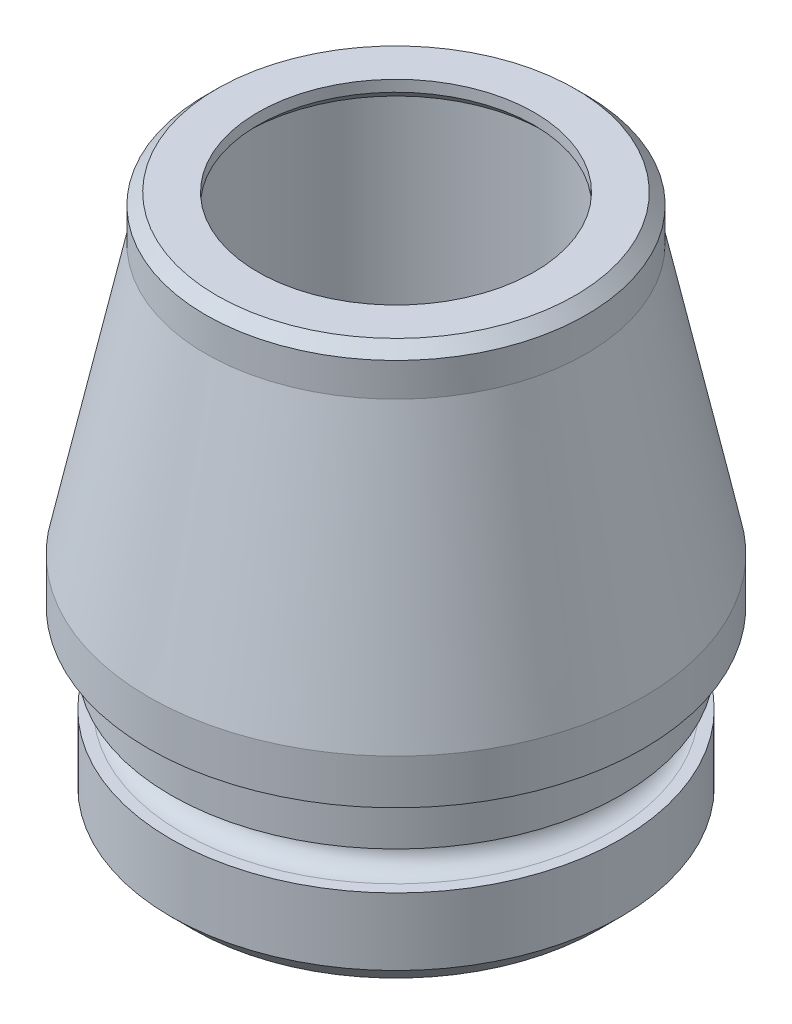
ISO-10303-21;
HEADER;
FILE_DESCRIPTION(('STEP AP214'),'2;1');
FILE_NAME('part.step','',(''),(''),'','','');
FILE_SCHEMA(('AUTOMOTIVE_DESIGN { 1 0 10303 214 1 1 1 1 }'));
ENDSEC;
DATA;
#1=APPLICATION_CONTEXT('core data for automotive mechanical design processes');
#2=APPLICATION_PROTOCOL_DEFINITION('international standard','automotive_design',2000,#1);
#3=PRODUCT_CONTEXT('',#1,'mechanical');
#4=PRODUCT('Part','Part','',(#3));
#5=PRODUCT_RELATED_PRODUCT_CATEGORY('part','',(#4));
#6=PRODUCT_DEFINITION_FORMATION('','',#4);
#7=PRODUCT_DEFINITION_CONTEXT('part definition',#1,'design');
#8=PRODUCT_DEFINITION('design','',#6,#7);
#9=PRODUCT_DEFINITION_SHAPE('','',#8);
#10=(LENGTH_UNIT() NAMED_UNIT(*) SI_UNIT(.MILLI.,.METRE.));
#11=(NAMED_UNIT(*) PLANE_ANGLE_UNIT() SI_UNIT($,.RADIAN.));
#12=(NAMED_UNIT(*) SI_UNIT($,.STERADIAN.) SOLID_ANGLE_UNIT());
#13=UNCERTAINTY_MEASURE_WITH_UNIT(LENGTH_MEASURE(1.E-05),#10,'distance_accuracy_value','');
#14=(GEOMETRIC_REPRESENTATION_CONTEXT(3) GLOBAL_UNCERTAINTY_ASSIGNED_CONTEXT((#13)) GLOBAL_UNIT_ASSIGNED_CONTEXT((#10,
#11,#12)) REPRESENTATION_CONTEXT('',''));
#15=CARTESIAN_POINT('',(0.,0.,0.));
#16=DIRECTION('',(0.,0.,1.));
#17=DIRECTION('',(1.,0.,0.));
#18=AXIS2_PLACEMENT_3D('',#15,#16,#17);
#19=CARTESIAN_POINT('',(0.,0.,-10.05));
#20=DIRECTION('',(0.,-1.,0.));
#21=DIRECTION('',(0.,0.,-1.));
#22=AXIS2_PLACEMENT_3D('',#19,#20,#21);
#23=PLANE('',#22);
#24=CARTESIAN_POINT('',(0.,0.,0.));
#25=DIRECTION('',(0.,-1.,0.));
#26=DIRECTION('',(0.,0.,-1.));
#27=AXIS2_PLACEMENT_3D('',#24,#25,#26);
#28=CIRCLE('',#27,7.4);
#29=CARTESIAN_POINT('',(0.,0.,-7.4));
#30=VERTEX_POINT('',#29);
#31=EDGE_CURVE('E41',#30,#30,#28,.F.);
#32=ORIENTED_EDGE('',*,*,#31,.T.);
#33=EDGE_LOOP('',(#32));
#34=FACE_BOUND('',#33,.T.);
#35=CARTESIAN_POINT('',(0.,0.,0.));
#36=DIRECTION('',(0.,-1.,0.));
#37=DIRECTION('',(0.,0.,-1.));
#38=AXIS2_PLACEMENT_3D('',#35,#36,#37);
#39=CIRCLE('',#38,9.05000000000001);
#40=CARTESIAN_POINT('',(0.,0.,-9.05000000000001));
#41=VERTEX_POINT('',#40);
#42=EDGE_CURVE('E59',#41,#41,#39,.T.);
#43=ORIENTED_EDGE('',*,*,#42,.T.);
#44=EDGE_LOOP('',(#43));
#45=FACE_BOUND('',#44,.T.);
#46=ADVANCED_FACE('F30',(#34,#45),#23,.T.);
#47=CARTESIAN_POINT('',(0.,0.,0.));
#48=DIRECTION('',(0.,-1.,0.));
#49=DIRECTION('',(0.,0.,-1.));
#50=AXIS2_PLACEMENT_3D('',#47,#48,#49);
#51=CYLINDRICAL_SURFACE('',#50,10.05);
#52=CARTESIAN_POINT('',(0.,0.999999999999997,0.));
#53=DIRECTION('',(0.,-1.,0.));
#54=DIRECTION('',(0.,0.,-1.));
#55=AXIS2_PLACEMENT_3D('',#52,#53,#54);
#56=CIRCLE('',#55,10.05);
#57=CARTESIAN_POINT('',(0.,0.999999999999997,-10.05));
#58=VERTEX_POINT('',#57);
#59=EDGE_CURVE('E56',#58,#58,#56,.F.);
#60=ORIENTED_EDGE('',*,*,#59,.T.);
#61=EDGE_LOOP('',(#60));
#62=FACE_BOUND('',#61,.T.);
#63=CARTESIAN_POINT('',(0.,4.,0.));
#64=DIRECTION('',(0.,-1.,0.));
#65=DIRECTION('',(0.,0.,-1.));
#66=AXIS2_PLACEMENT_3D('',#63,#64,#65);
#67=CIRCLE('',#66,10.05);
#68=CARTESIAN_POINT('',(0.,4.,-10.05));
#69=VERTEX_POINT('',#68);
#70=EDGE_CURVE('E62',#69,#69,#67,.T.);
#71=ORIENTED_EDGE('',*,*,#70,.T.);
#72=EDGE_LOOP('',(#71));
#73=FACE_BOUND('',#72,.T.);
#74=ADVANCED_FACE('F110',(#62,#73),#51,.T.);
#75=CARTESIAN_POINT('',(0.,4.,-9.55));
#76=DIRECTION('',(0.,1.,0.));
#77=DIRECTION('',(0.,0.,1.));
#78=AXIS2_PLACEMENT_3D('',#75,#76,#77);
#79=PLANE('',#78);
#80=CARTESIAN_POINT('',(0.,4.,0.));
#81=DIRECTION('',(0.,-1.,0.));
#82=DIRECTION('',(0.,0.,-1.));
#83=AXIS2_PLACEMENT_3D('',#80,#81,#82);
#84=CIRCLE('',#83,9.55);
#85=CARTESIAN_POINT('',(0.,4.,-9.55));
#86=VERTEX_POINT('',#85);
#87=EDGE_CURVE('E65',#86,#86,#84,.T.);
#88=ORIENTED_EDGE('',*,*,#87,.T.);
#89=EDGE_LOOP('',(#88));
#90=FACE_BOUND('',#89,.T.);
#91=ORIENTED_EDGE('',*,*,#70,.F.);
#92=EDGE_LOOP('',(#91));
#93=FACE_BOUND('',#92,.T.);
#94=ADVANCED_FACE('F116',(#90,#93),#79,.T.);
#95=CARTESIAN_POINT('',(0.,4.85,0.));
#96=DIRECTION('',(0.,-1.,0.));
#97=DIRECTION('',(0.,0.,-1.));
#98=AXIS2_PLACEMENT_3D('',#95,#96,#97);
#99=TOROIDAL_SURFACE('',#98,9.55,0.850000000000002);
#100=CARTESIAN_POINT('',(0.,5.7,0.));
#101=DIRECTION('',(0.,-1.,0.));
#102=DIRECTION('',(0.,0.,-1.));
#103=AXIS2_PLACEMENT_3D('',#100,#101,#102);
#104=CIRCLE('',#103,9.55);
#105=CARTESIAN_POINT('',(0.,5.7,-9.55));
#106=VERTEX_POINT('',#105);
#107=EDGE_CURVE('E68',#106,#106,#104,.T.);
#108=ORIENTED_EDGE('',*,*,#107,.T.);
#109=EDGE_LOOP('',(#108));
#110=FACE_BOUND('',#109,.T.);
#111=ORIENTED_EDGE('',*,*,#87,.F.);
#112=EDGE_LOOP('',(#111));
#113=FACE_BOUND('',#112,.T.);
#114=ADVANCED_FACE('F253',(#110,#113),#99,.F.);
#115=CARTESIAN_POINT('',(0.,5.7,-9.55));
#116=DIRECTION('',(0.,-1.,0.));
#117=DIRECTION('',(0.,0.,-1.));
#118=AXIS2_PLACEMENT_3D('',#115,#116,#117);
#119=PLANE('',#118);
#120=CARTESIAN_POINT('',(0.,5.7,0.));
#121=DIRECTION('',(0.,-1.,0.));
#122=DIRECTION('',(0.,0.,-1.));
#123=AXIS2_PLACEMENT_3D('',#120,#121,#122);
#124=CIRCLE('',#123,10.05);
#125=CARTESIAN_POINT('',(0.,5.7,-10.05));
#126=VERTEX_POINT('',#125);
#127=EDGE_CURVE('E71',#126,#126,#124,.T.);
#128=ORIENTED_EDGE('',*,*,#127,.T.);
#129=EDGE_LOOP('',(#128));
#130=FACE_BOUND('',#129,.T.);
#131=ORIENTED_EDGE('',*,*,#107,.F.);
#132=EDGE_LOOP('',(#131));
#133=FACE_BOUND('',#132,.T.);
#134=ADVANCED_FACE('F243',(#130,#133),#119,.T.);
#135=CARTESIAN_POINT('',(0.,0.,0.));
#136=DIRECTION('',(0.,-1.,0.));
#137=DIRECTION('',(0.,0.,-1.));
#138=AXIS2_PLACEMENT_3D('',#135,#136,#137);
#139=CYLINDRICAL_SURFACE('',#138,10.05);
#140=CARTESIAN_POINT('',(0.,8.00000000000003,0.));
#141=DIRECTION('',(0.,-1.,0.));
#142=DIRECTION('',(0.,0.,-1.));
#143=AXIS2_PLACEMENT_3D('',#140,#141,#142);
#144=CIRCLE('',#143,10.05);
#145=CARTESIAN_POINT('',(0.,8.00000000000003,-10.05));
#146=VERTEX_POINT('',#145);
#147=EDGE_CURVE('E74',#146,#146,#144,.T.);
#148=ORIENTED_EDGE('',*,*,#147,.T.);
#149=EDGE_LOOP('',(#148));
#150=FACE_BOUND('',#149,.T.);
#151=ORIENTED_EDGE('',*,*,#127,.F.);
#152=EDGE_LOOP('',(#151));
#153=FACE_BOUND('',#152,.T.);
#154=ADVANCED_FACE('F233',(#150,#153),#139,.T.);
#155=CARTESIAN_POINT('',(0.,8.00000000000003,-11.05));
#156=DIRECTION('',(0.,-1.,0.));
#157=DIRECTION('',(0.,0.,-1.));
#158=AXIS2_PLACEMENT_3D('',#155,#156,#157);
#159=PLANE('',#158);
#160=CARTESIAN_POINT('',(0.,8.00000000000003,0.));
#161=DIRECTION('',(0.,-1.,0.));
#162=DIRECTION('',(0.,0.,-1.));
#163=AXIS2_PLACEMENT_3D('',#160,#161,#162);
#164=CIRCLE('',#163,11.05);
#165=CARTESIAN_POINT('',(0.,8.00000000000003,-11.05));
#166=VERTEX_POINT('',#165);
#167=EDGE_CURVE('E77',#166,#166,#164,.T.);
#168=ORIENTED_EDGE('',*,*,#167,.T.);
#169=EDGE_LOOP('',(#168));
#170=FACE_BOUND('',#169,.T.);
#171=ORIENTED_EDGE('',*,*,#147,.F.);
#172=EDGE_LOOP('',(#171));
#173=FACE_BOUND('',#172,.T.);
#174=ADVANCED_FACE('F223',(#170,#173),#159,.T.);
#175=CARTESIAN_POINT('',(0.,0.,0.));
#176=DIRECTION('',(0.,-1.,0.));
#177=DIRECTION('',(0.,0.,-1.));
#178=AXIS2_PLACEMENT_3D('',#175,#176,#177);
#179=CYLINDRICAL_SURFACE('',#178,11.05);
#180=CARTESIAN_POINT('',(0.,10.,0.));
#181=DIRECTION('',(0.,-1.,0.));
#182=DIRECTION('',(0.,0.,-1.));
#183=AXIS2_PLACEMENT_3D('',#180,#181,#182);
#184=CIRCLE('',#183,11.05);
#185=CARTESIAN_POINT('',(0.,10.,-11.05));
#186=VERTEX_POINT('',#185);
#187=EDGE_CURVE('E80',#186,#186,#184,.T.);
#188=ORIENTED_EDGE('',*,*,#187,.T.);
#189=EDGE_LOOP('',(#188));
#190=FACE_BOUND('',#189,.T.);
#191=ORIENTED_EDGE('',*,*,#167,.F.);
#192=EDGE_LOOP('',(#191));
#193=FACE_BOUND('',#192,.T.);
#194=ADVANCED_FACE('F213',(#190,#193),#179,.T.);
#195=CARTESIAN_POINT('',(0.,10.,0.));
#196=DIRECTION('',(0.,-1.,0.));
#197=DIRECTION('',(0.,0.,-1.));
#198=AXIS2_PLACEMENT_3D('',#195,#196,#197);
#199=CONICAL_SURFACE('',#198,11.05,0.209385392953496);
#200=CARTESIAN_POINT('',(0.,22.,0.));
#201=DIRECTION('',(0.,-1.,0.));
#202=DIRECTION('',(0.,0.,-1.));
#203=AXIS2_PLACEMENT_3D('',#200,#201,#202);
#204=CIRCLE('',#203,8.5);
#205=CARTESIAN_POINT('',(0.,22.,-8.5));
#206=VERTEX_POINT('',#205);
#207=EDGE_CURVE('E83',#206,#206,#204,.T.);
#208=ORIENTED_EDGE('',*,*,#207,.T.);
#209=EDGE_LOOP('',(#208));
#210=FACE_BOUND('',#209,.T.);
#211=ORIENTED_EDGE('',*,*,#187,.F.);
#212=EDGE_LOOP('',(#211));
#213=FACE_BOUND('',#212,.T.);
#214=ADVANCED_FACE('F191',(#210,#213),#199,.T.);
#215=CARTESIAN_POINT('',(0.,0.,0.));
#216=DIRECTION('',(0.,-1.,0.));
#217=DIRECTION('',(0.,0.,-1.));
#218=AXIS2_PLACEMENT_3D('',#215,#216,#217);
#219=CYLINDRICAL_SURFACE('',#218,8.5);
#220=CARTESIAN_POINT('',(0.,23.5,0.));
#221=DIRECTION('',(0.,1.,0.));
#222=DIRECTION('',(0.,0.,1.));
#223=AXIS2_PLACEMENT_3D('',#220,#221,#222);
#224=CIRCLE('',#223,8.5);
#225=CARTESIAN_POINT('',(0.,23.5,8.5));
#226=VERTEX_POINT('',#225);
#227=EDGE_CURVE('E53',#226,#226,#224,.F.);
#228=ORIENTED_EDGE('',*,*,#227,.T.);
#229=EDGE_LOOP('',(#228));
#230=FACE_BOUND('',#229,.T.);
#231=ORIENTED_EDGE('',*,*,#207,.F.);
#232=EDGE_LOOP('',(#231));
#233=FACE_BOUND('',#232,.T.);
#234=ADVANCED_FACE('F181',(#230,#233),#219,.T.);
#235=CARTESIAN_POINT('',(0.,24.,-6.175));
#236=DIRECTION('',(0.,1.,0.));
#237=DIRECTION('',(0.,0.,1.));
#238=AXIS2_PLACEMENT_3D('',#235,#236,#237);
#239=PLANE('',#238);
#240=CARTESIAN_POINT('',(0.,24.,0.));
#241=DIRECTION('',(0.,1.,0.));
#242=DIRECTION('',(0.,0.,1.));
#243=AXIS2_PLACEMENT_3D('',#240,#241,#242);
#244=CIRCLE('',#243,8.);
#245=CARTESIAN_POINT('',(0.,24.,8.));
#246=VERTEX_POINT('',#245);
#247=EDGE_CURVE('E50',#246,#246,#244,.T.);
#248=ORIENTED_EDGE('',*,*,#247,.T.);
#249=EDGE_LOOP('',(#248));
#250=FACE_BOUND('',#249,.T.);
#251=CARTESIAN_POINT('',(0.,24.,0.));
#252=DIRECTION('',(0.,-1.,0.));
#253=DIRECTION('',(0.,0.,-1.));
#254=AXIS2_PLACEMENT_3D('',#251,#252,#253);
#255=CIRCLE('',#254,6.175);
#256=CARTESIAN_POINT('',(0.,24.,-6.175));
#257=VERTEX_POINT('',#256);
#258=EDGE_CURVE('E86',#257,#257,#255,.T.);
#259=ORIENTED_EDGE('',*,*,#258,.T.);
#260=EDGE_LOOP('',(#259));
#261=FACE_BOUND('',#260,.T.);
#262=ADVANCED_FACE('F153',(#250,#261),#239,.T.);
#263=CARTESIAN_POINT('',(0.,0.,0.));
#264=DIRECTION('',(0.,-1.,0.));
#265=DIRECTION('',(0.,0.,-1.));
#266=AXIS2_PLACEMENT_3D('',#263,#264,#265);
#267=CYLINDRICAL_SURFACE('',#266,6.175);
#268=CARTESIAN_POINT('',(0.,23.5,0.));
#269=DIRECTION('',(0.,-1.,0.));
#270=DIRECTION('',(0.,0.,-1.));
#271=AXIS2_PLACEMENT_3D('',#268,#269,#270);
#272=CIRCLE('',#271,6.175);
#273=CARTESIAN_POINT('',(0.,23.5,-6.175));
#274=VERTEX_POINT('',#273);
#275=EDGE_CURVE('E37',#274,#274,#272,.T.);
#276=ORIENTED_EDGE('',*,*,#275,.T.);
#277=EDGE_LOOP('',(#276));
#278=FACE_BOUND('',#277,.T.);
#279=ORIENTED_EDGE('',*,*,#258,.F.);
#280=EDGE_LOOP('',(#279));
#281=FACE_BOUND('',#280,.T.);
#282=ADVANCED_FACE('F107',(#278,#281),#267,.F.);
#283=CARTESIAN_POINT('',(0.,23.,-7.1));
#284=DIRECTION('',(0.,-1.,0.));
#285=DIRECTION('',(0.,0.,-1.));
#286=AXIS2_PLACEMENT_3D('',#283,#284,#285);
#287=PLANE('',#286);
#288=CARTESIAN_POINT('',(0.,23.,0.));
#289=DIRECTION('',(0.,-1.,0.));
#290=DIRECTION('',(0.,0.,-1.));
#291=AXIS2_PLACEMENT_3D('',#288,#289,#290);
#292=CIRCLE('',#291,6.67500000000001);
#293=CARTESIAN_POINT('',(0.,23.,-6.67500000000001));
#294=VERTEX_POINT('',#293);
#295=EDGE_CURVE('E10',#294,#294,#292,.F.);
#296=ORIENTED_EDGE('',*,*,#295,.T.);
#297=EDGE_LOOP('',(#296));
#298=FACE_BOUND('',#297,.T.);
#299=CARTESIAN_POINT('',(0.,23.,0.));
#300=DIRECTION('',(0.,-1.,0.));
#301=DIRECTION('',(0.,0.,-1.));
#302=AXIS2_PLACEMENT_3D('',#299,#300,#301);
#303=CIRCLE('',#302,7.1);
#304=CARTESIAN_POINT('',(0.,23.,-7.1));
#305=VERTEX_POINT('',#304);
#306=EDGE_CURVE('E89',#305,#305,#303,.T.);
#307=ORIENTED_EDGE('',*,*,#306,.T.);
#308=EDGE_LOOP('',(#307));
#309=FACE_BOUND('',#308,.T.);
#310=ADVANCED_FACE('F93',(#298,#309),#287,.T.);
#311=CARTESIAN_POINT('',(0.,0.,0.));
#312=DIRECTION('',(0.,-1.,0.));
#313=DIRECTION('',(0.,0.,-1.));
#314=AXIS2_PLACEMENT_3D('',#311,#312,#313);
#315=CYLINDRICAL_SURFACE('',#314,7.1);
#316=CARTESIAN_POINT('',(0.,0.300000000000002,0.));
#317=DIRECTION('',(0.,-1.,0.));
#318=DIRECTION('',(0.,0.,-1.));
#319=AXIS2_PLACEMENT_3D('',#316,#317,#318);
#320=CIRCLE('',#319,7.1);
#321=CARTESIAN_POINT('',(0.,0.300000000000002,-7.1));
#322=VERTEX_POINT('',#321);
#323=EDGE_CURVE('E45',#322,#322,#320,.T.);
#324=ORIENTED_EDGE('',*,*,#323,.T.);
#325=EDGE_LOOP('',(#324));
#326=FACE_BOUND('',#325,.T.);
#327=ORIENTED_EDGE('',*,*,#306,.F.);
#328=EDGE_LOOP('',(#327));
#329=FACE_BOUND('',#328,.T.);
#330=ADVANCED_FACE('F95',(#326,#329),#315,.F.);
#331=CARTESIAN_POINT('',(0.,0.,0.));
#332=DIRECTION('',(0.,1.,0.));
#333=DIRECTION('',(0.,0.,1.));
#334=AXIS2_PLACEMENT_3D('',#331,#332,#333);
#335=CONICAL_SURFACE('',#334,9.05000000000001,0.785398163397445);
#336=ORIENTED_EDGE('',*,*,#59,.F.);
#337=EDGE_LOOP('',(#336));
#338=FACE_BOUND('',#337,.T.);
#339=ORIENTED_EDGE('',*,*,#42,.F.);
#340=EDGE_LOOP('',(#339));
#341=FACE_BOUND('',#340,.T.);
#342=ADVANCED_FACE('F97',(#338,#341),#335,.T.);
#343=CARTESIAN_POINT('',(0.,23.5,0.));
#344=DIRECTION('',(0.,-1.,0.));
#345=DIRECTION('',(0.,0.,-1.));
#346=AXIS2_PLACEMENT_3D('',#343,#344,#345);
#347=CONICAL_SURFACE('',#346,8.5,0.785398163397445);
#348=ORIENTED_EDGE('',*,*,#247,.F.);
#349=EDGE_LOOP('',(#348));
#350=FACE_BOUND('',#349,.T.);
#351=ORIENTED_EDGE('',*,*,#227,.F.);
#352=EDGE_LOOP('',(#351));
#353=FACE_BOUND('',#352,.T.);
#354=ADVANCED_FACE('F104',(#350,#353),#347,.T.);
#355=CARTESIAN_POINT('',(0.,0.300000000000002,0.));
#356=DIRECTION('',(0.,-1.,0.));
#357=DIRECTION('',(0.,0.,-1.));
#358=AXIS2_PLACEMENT_3D('',#355,#356,#357);
#359=TOROIDAL_SURFACE('',#358,7.4,0.3);
#360=ORIENTED_EDGE('',*,*,#31,.F.);
#361=EDGE_LOOP('',(#360));
#362=FACE_BOUND('',#361,.T.);
#363=ORIENTED_EDGE('',*,*,#323,.F.);
#364=EDGE_LOOP('',(#363));
#365=FACE_BOUND('',#364,.T.);
#366=ADVANCED_FACE('F123',(#362,#365),#359,.T.);
#367=CARTESIAN_POINT('',(0.,23.5,0.));
#368=DIRECTION('',(0.,-1.,0.));
#369=DIRECTION('',(0.,0.,-1.));
#370=AXIS2_PLACEMENT_3D('',#367,#368,#369);
#371=CONICAL_SURFACE('',#370,6.175,0.785398163397455);
#372=ORIENTED_EDGE('',*,*,#295,.F.);
#373=EDGE_LOOP('',(#372));
#374=FACE_BOUND('',#373,.T.);
#375=ORIENTED_EDGE('',*,*,#275,.F.);
#376=EDGE_LOOP('',(#375));
#377=FACE_BOUND('',#376,.T.);
#378=ADVANCED_FACE('F32',(#374,#377),#371,.F.);
#379=CLOSED_SHELL('',(#46,#74,#94,#114,#134,#154,#174,#194,#214,#234,#262,#282,#310,#330,#342,
#354,#366,#378));
#380=MANIFOLD_SOLID_BREP('B2',#379);
#381=ADVANCED_BREP_SHAPE_REPRESENTATION('',(#18,#380),#14);
#382=SHAPE_DEFINITION_REPRESENTATION(#9,#381);
ENDSEC;
END-ISO-10303-21;
